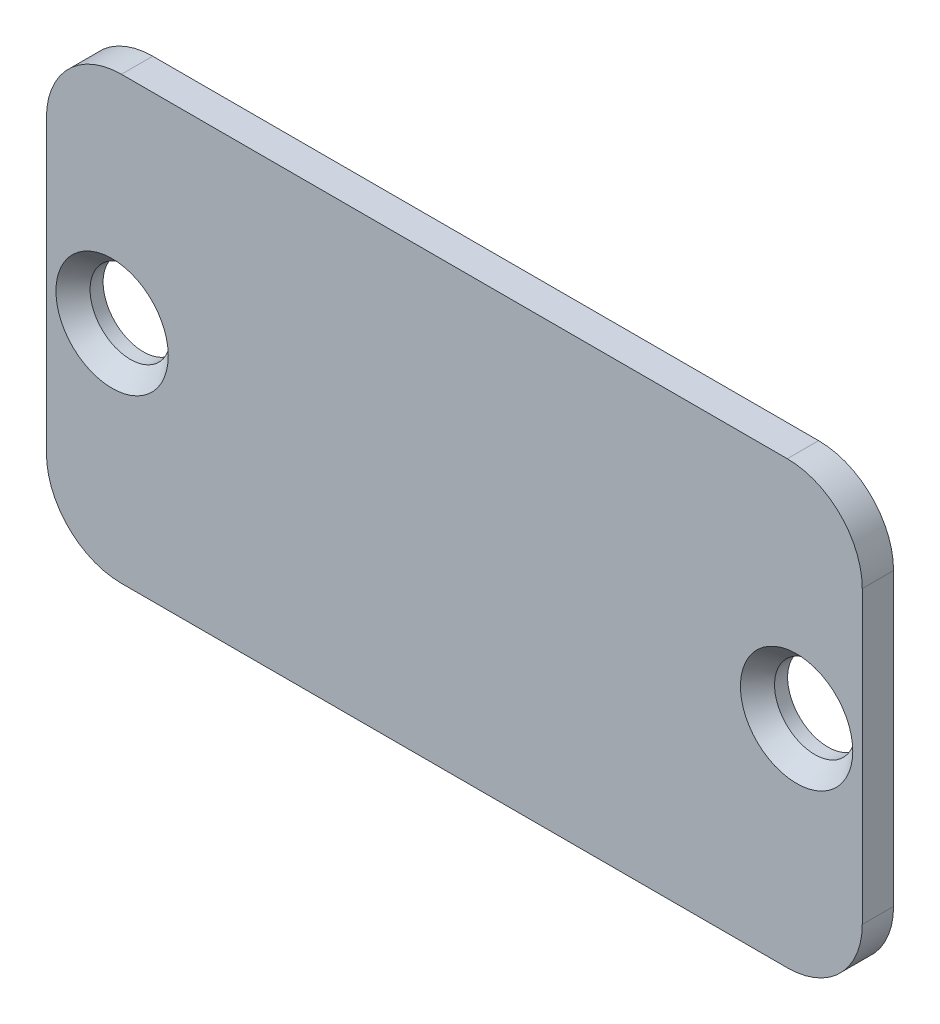
ISO-10303-21;
HEADER;
FILE_DESCRIPTION(('STEP AP214'),'2;1');
FILE_NAME('part.step','',(''),(''),'','','');
FILE_SCHEMA(('AUTOMOTIVE_DESIGN { 1 0 10303 214 1 1 1 1 }'));
ENDSEC;
DATA;
#1=APPLICATION_CONTEXT('core data for automotive mechanical design processes');
#2=APPLICATION_PROTOCOL_DEFINITION('international standard','automotive_design',2000,#1);
#3=PRODUCT_CONTEXT('',#1,'mechanical');
#4=PRODUCT('Part','Part','',(#3));
#5=PRODUCT_RELATED_PRODUCT_CATEGORY('part','',(#4));
#6=PRODUCT_DEFINITION_FORMATION('','',#4);
#7=PRODUCT_DEFINITION_CONTEXT('part definition',#1,'design');
#8=PRODUCT_DEFINITION('design','',#6,#7);
#9=PRODUCT_DEFINITION_SHAPE('','',#8);
#10=(LENGTH_UNIT() NAMED_UNIT(*) SI_UNIT(.MILLI.,.METRE.));
#11=(NAMED_UNIT(*) PLANE_ANGLE_UNIT() SI_UNIT($,.RADIAN.));
#12=(NAMED_UNIT(*) SI_UNIT($,.STERADIAN.) SOLID_ANGLE_UNIT());
#13=UNCERTAINTY_MEASURE_WITH_UNIT(LENGTH_MEASURE(1.E-05),#10,'distance_accuracy_value','');
#14=(GEOMETRIC_REPRESENTATION_CONTEXT(3) GLOBAL_UNCERTAINTY_ASSIGNED_CONTEXT((#13)) GLOBAL_UNIT_ASSIGNED_CONTEXT((#10,
#11,#12)) REPRESENTATION_CONTEXT('',''));
#15=CARTESIAN_POINT('',(0.,0.,0.));
#16=DIRECTION('',(0.,0.,1.));
#17=DIRECTION('',(1.,0.,0.));
#18=AXIS2_PLACEMENT_3D('',#15,#16,#17);
#19=CARTESIAN_POINT('',(-16.9188945819453,7.56499999999998,33.027926773219));
#20=DIRECTION('',(0.,0.,-1.));
#21=DIRECTION('',(-1.,0.,0.));
#22=AXIS2_PLACEMENT_3D('',#19,#20,#21);
#23=CYLINDRICAL_SURFACE('',#22,3.90000000000002);
#24=CARTESIAN_POINT('',(-16.9188945819453,7.56499999999998,31.399786773219));
#25=DIRECTION('',(0.,0.,-1.));
#26=DIRECTION('',(-1.,0.,0.));
#27=AXIS2_PLACEMENT_3D('',#24,#25,#26);
#28=CIRCLE('',#27,3.90000000000002);
#29=CARTESIAN_POINT('',(-20.8188945819453,7.565,31.399786773219));
#30=VERTEX_POINT('',#29);
#31=CARTESIAN_POINT('',(-16.9188945819453,11.465,31.399786773219));
#32=VERTEX_POINT('',#31);
#33=EDGE_CURVE('E134',#30,#32,#28,.T.);
#34=ORIENTED_EDGE('',*,*,#33,.F.);
#35=DIRECTION('',(0.,0.,-1.));
#36=VECTOR('',#35,1.);
#37=CARTESIAN_POINT('',(-20.8188945819453,7.565,33.027926773219));
#38=LINE('',#37,#36);
#39=CARTESIAN_POINT('',(-20.8188945819453,7.565,33.027926773219));
#40=VERTEX_POINT('',#39);
#41=EDGE_CURVE('E11',#40,#30,#38,.T.);
#42=ORIENTED_EDGE('',*,*,#41,.F.);
#43=CARTESIAN_POINT('',(-16.9188945819453,7.56499999999998,33.027926773219));
#44=DIRECTION('',(0.,0.,-1.));
#45=DIRECTION('',(-1.,0.,0.));
#46=AXIS2_PLACEMENT_3D('',#43,#44,#45);
#47=CIRCLE('',#46,3.90000000000002);
#48=CARTESIAN_POINT('',(-16.9188945819453,11.465,33.027926773219));
#49=VERTEX_POINT('',#48);
#50=EDGE_CURVE('E155',#40,#49,#47,.T.);
#51=ORIENTED_EDGE('',*,*,#50,.T.);
#52=DIRECTION('',(0.,0.,-1.));
#53=VECTOR('',#52,1.);
#54=CARTESIAN_POINT('',(-16.9188945819453,11.465,33.027926773219));
#55=LINE('',#54,#53);
#56=EDGE_CURVE('E40',#49,#32,#55,.T.);
#57=ORIENTED_EDGE('',*,*,#56,.T.);
#58=EDGE_LOOP('',(#34,#42,#51,#57));
#59=FACE_BOUND('',#58,.T.);
#60=ADVANCED_FACE('F37',(#59),#23,.T.);
#61=CARTESIAN_POINT('',(-20.8188945819453,-7.565,33.027926773219));
#62=DIRECTION('',(-1.,0.,0.));
#63=DIRECTION('',(0.,0.,1.));
#64=AXIS2_PLACEMENT_3D('',#61,#62,#63);
#65=PLANE('',#64);
#66=DIRECTION('',(0.,1.,0.));
#67=VECTOR('',#66,1.);
#68=CARTESIAN_POINT('',(-20.8188945819453,-7.565,31.399786773219));
#69=LINE('',#68,#67);
#70=CARTESIAN_POINT('',(-20.8188945819453,-7.565,31.399786773219));
#71=VERTEX_POINT('',#70);
#72=EDGE_CURVE('E153',#71,#30,#69,.T.);
#73=ORIENTED_EDGE('',*,*,#72,.F.);
#74=DIRECTION('',(0.,0.,-1.));
#75=VECTOR('',#74,1.);
#76=CARTESIAN_POINT('',(-20.8188945819453,-7.565,33.027926773219));
#77=LINE('',#76,#75);
#78=CARTESIAN_POINT('',(-20.8188945819453,-7.565,33.027926773219));
#79=VERTEX_POINT('',#78);
#80=EDGE_CURVE('E46',#79,#71,#77,.T.);
#81=ORIENTED_EDGE('',*,*,#80,.F.);
#82=DIRECTION('',(0.,1.,0.));
#83=VECTOR('',#82,1.);
#84=CARTESIAN_POINT('',(-20.8188945819453,-7.565,33.027926773219));
#85=LINE('',#84,#83);
#86=EDGE_CURVE('E124',#79,#40,#85,.T.);
#87=ORIENTED_EDGE('',*,*,#86,.T.);
#88=ORIENTED_EDGE('',*,*,#41,.T.);
#89=EDGE_LOOP('',(#73,#81,#87,#88));
#90=FACE_BOUND('',#89,.T.);
#91=ADVANCED_FACE('F167',(#90),#65,.T.);
#92=CARTESIAN_POINT('',(-16.9188945819453,-7.56499999999997,33.027926773219));
#93=DIRECTION('',(0.,0.,-1.));
#94=DIRECTION('',(-1.,0.,0.));
#95=AXIS2_PLACEMENT_3D('',#92,#93,#94);
#96=CYLINDRICAL_SURFACE('',#95,3.90000000000002);
#97=CARTESIAN_POINT('',(-16.9188945819453,-7.56499999999997,31.399786773219));
#98=DIRECTION('',(0.,0.,-1.));
#99=DIRECTION('',(-1.,0.,0.));
#100=AXIS2_PLACEMENT_3D('',#97,#98,#99);
#101=CIRCLE('',#100,3.90000000000002);
#102=CARTESIAN_POINT('',(-16.9188945819453,-11.465,31.399786773219));
#103=VERTEX_POINT('',#102);
#104=EDGE_CURVE('E111',#103,#71,#101,.T.);
#105=ORIENTED_EDGE('',*,*,#104,.F.);
#106=DIRECTION('',(0.,0.,-1.));
#107=VECTOR('',#106,1.);
#108=CARTESIAN_POINT('',(-16.9188945819453,-11.465,33.027926773219));
#109=LINE('',#108,#107);
#110=CARTESIAN_POINT('',(-16.9188945819453,-11.465,33.027926773219));
#111=VERTEX_POINT('',#110);
#112=EDGE_CURVE('E106',#111,#103,#109,.T.);
#113=ORIENTED_EDGE('',*,*,#112,.F.);
#114=CARTESIAN_POINT('',(-16.9188945819453,-7.56499999999997,33.027926773219));
#115=DIRECTION('',(0.,0.,-1.));
#116=DIRECTION('',(-1.,0.,0.));
#117=AXIS2_PLACEMENT_3D('',#114,#115,#116);
#118=CIRCLE('',#117,3.90000000000002);
#119=EDGE_CURVE('E109',#111,#79,#118,.T.);
#120=ORIENTED_EDGE('',*,*,#119,.T.);
#121=ORIENTED_EDGE('',*,*,#80,.T.);
#122=EDGE_LOOP('',(#105,#113,#120,#121));
#123=FACE_BOUND('',#122,.T.);
#124=ADVANCED_FACE('F108',(#123),#96,.T.);
#125=CARTESIAN_POINT('',(17.7111054180547,-11.465,33.027926773219));
#126=DIRECTION('',(0.,-1.,0.));
#127=DIRECTION('',(0.,0.,-1.));
#128=AXIS2_PLACEMENT_3D('',#125,#126,#127);
#129=PLANE('',#128);
#130=DIRECTION('',(-1.,0.,0.));
#131=VECTOR('',#130,1.);
#132=CARTESIAN_POINT('',(17.7111054180547,-11.465,31.399786773219));
#133=LINE('',#132,#131);
#134=CARTESIAN_POINT('',(17.7111054180547,-11.465,31.399786773219));
#135=VERTEX_POINT('',#134);
#136=EDGE_CURVE('E150',#135,#103,#133,.T.);
#137=ORIENTED_EDGE('',*,*,#136,.F.);
#138=DIRECTION('',(0.,0.,-1.));
#139=VECTOR('',#138,1.);
#140=CARTESIAN_POINT('',(17.7111054180547,-11.465,33.027926773219));
#141=LINE('',#140,#139);
#142=CARTESIAN_POINT('',(17.7111054180547,-11.465,33.027926773219));
#143=VERTEX_POINT('',#142);
#144=EDGE_CURVE('E116',#143,#135,#141,.T.);
#145=ORIENTED_EDGE('',*,*,#144,.F.);
#146=DIRECTION('',(-1.,0.,0.));
#147=VECTOR('',#146,1.);
#148=CARTESIAN_POINT('',(17.7111054180547,-11.465,33.027926773219));
#149=LINE('',#148,#147);
#150=EDGE_CURVE('E122',#143,#111,#149,.T.);
#151=ORIENTED_EDGE('',*,*,#150,.T.);
#152=ORIENTED_EDGE('',*,*,#112,.T.);
#153=EDGE_LOOP('',(#137,#145,#151,#152));
#154=FACE_BOUND('',#153,.T.);
#155=ADVANCED_FACE('F126',(#154),#129,.T.);
#156=CARTESIAN_POINT('',(17.7111054180547,-7.565,33.027926773219));
#157=DIRECTION('',(0.,0.,-1.));
#158=DIRECTION('',(-1.,0.,0.));
#159=AXIS2_PLACEMENT_3D('',#156,#157,#158);
#160=CYLINDRICAL_SURFACE('',#159,3.9);
#161=CARTESIAN_POINT('',(17.7111054180547,-7.565,31.399786773219));
#162=DIRECTION('',(0.,0.,-1.));
#163=DIRECTION('',(-1.,0.,0.));
#164=AXIS2_PLACEMENT_3D('',#161,#162,#163);
#165=CIRCLE('',#164,3.9);
#166=CARTESIAN_POINT('',(21.6111054180547,-7.565,31.399786773219));
#167=VERTEX_POINT('',#166);
#168=EDGE_CURVE('E147',#167,#135,#165,.T.);
#169=ORIENTED_EDGE('',*,*,#168,.F.);
#170=DIRECTION('',(0.,0.,-1.));
#171=VECTOR('',#170,1.);
#172=CARTESIAN_POINT('',(21.6111054180547,-7.565,33.027926773219));
#173=LINE('',#172,#171);
#174=CARTESIAN_POINT('',(21.6111054180547,-7.565,33.027926773219));
#175=VERTEX_POINT('',#174);
#176=EDGE_CURVE('E159',#175,#167,#173,.T.);
#177=ORIENTED_EDGE('',*,*,#176,.F.);
#178=CARTESIAN_POINT('',(17.7111054180547,-7.565,33.027926773219));
#179=DIRECTION('',(0.,0.,-1.));
#180=DIRECTION('',(-1.,0.,0.));
#181=AXIS2_PLACEMENT_3D('',#178,#179,#180);
#182=CIRCLE('',#181,3.9);
#183=EDGE_CURVE('E127',#175,#143,#182,.T.);
#184=ORIENTED_EDGE('',*,*,#183,.T.);
#185=ORIENTED_EDGE('',*,*,#144,.T.);
#186=EDGE_LOOP('',(#169,#177,#184,#185));
#187=FACE_BOUND('',#186,.T.);
#188=ADVANCED_FACE('F180',(#187),#160,.T.);
#189=CARTESIAN_POINT('',(21.6111054180547,7.565,33.027926773219));
#190=DIRECTION('',(1.,0.,0.));
#191=DIRECTION('',(0.,0.,-1.));
#192=AXIS2_PLACEMENT_3D('',#189,#190,#191);
#193=PLANE('',#192);
#194=DIRECTION('',(0.,-1.,0.));
#195=VECTOR('',#194,1.);
#196=CARTESIAN_POINT('',(21.6111054180547,7.565,31.399786773219));
#197=LINE('',#196,#195);
#198=CARTESIAN_POINT('',(21.6111054180547,7.565,31.399786773219));
#199=VERTEX_POINT('',#198);
#200=EDGE_CURVE('E144',#199,#167,#197,.T.);
#201=ORIENTED_EDGE('',*,*,#200,.F.);
#202=DIRECTION('',(0.,0.,-1.));
#203=VECTOR('',#202,1.);
#204=CARTESIAN_POINT('',(21.6111054180547,7.565,33.027926773219));
#205=LINE('',#204,#203);
#206=CARTESIAN_POINT('',(21.6111054180547,7.565,33.027926773219));
#207=VERTEX_POINT('',#206);
#208=EDGE_CURVE('E161',#207,#199,#205,.T.);
#209=ORIENTED_EDGE('',*,*,#208,.F.);
#210=DIRECTION('',(0.,-1.,0.));
#211=VECTOR('',#210,1.);
#212=CARTESIAN_POINT('',(21.6111054180547,7.565,33.027926773219));
#213=LINE('',#212,#211);
#214=EDGE_CURVE('E129',#207,#175,#213,.T.);
#215=ORIENTED_EDGE('',*,*,#214,.T.);
#216=ORIENTED_EDGE('',*,*,#176,.T.);
#217=EDGE_LOOP('',(#201,#209,#215,#216));
#218=FACE_BOUND('',#217,.T.);
#219=ADVANCED_FACE('F183',(#218),#193,.T.);
#220=CARTESIAN_POINT('',(17.7111054180547,7.56499999999998,33.027926773219));
#221=DIRECTION('',(0.,0.,-1.));
#222=DIRECTION('',(-1.,0.,0.));
#223=AXIS2_PLACEMENT_3D('',#220,#221,#222);
#224=CYLINDRICAL_SURFACE('',#223,3.90000000000002);
#225=CARTESIAN_POINT('',(17.7111054180547,7.56499999999998,31.399786773219));
#226=DIRECTION('',(0.,0.,-1.));
#227=DIRECTION('',(-1.,0.,0.));
#228=AXIS2_PLACEMENT_3D('',#225,#226,#227);
#229=CIRCLE('',#228,3.90000000000002);
#230=CARTESIAN_POINT('',(17.7111054180547,11.465,31.399786773219));
#231=VERTEX_POINT('',#230);
#232=EDGE_CURVE('E141',#231,#199,#229,.T.);
#233=ORIENTED_EDGE('',*,*,#232,.F.);
#234=DIRECTION('',(0.,0.,-1.));
#235=VECTOR('',#234,1.);
#236=CARTESIAN_POINT('',(17.7111054180547,11.465,33.027926773219));
#237=LINE('',#236,#235);
#238=CARTESIAN_POINT('',(17.7111054180547,11.465,33.027926773219));
#239=VERTEX_POINT('',#238);
#240=EDGE_CURVE('E162',#239,#231,#237,.T.);
#241=ORIENTED_EDGE('',*,*,#240,.F.);
#242=CARTESIAN_POINT('',(17.7111054180547,7.56499999999998,33.027926773219));
#243=DIRECTION('',(0.,0.,-1.));
#244=DIRECTION('',(-1.,0.,0.));
#245=AXIS2_PLACEMENT_3D('',#242,#243,#244);
#246=CIRCLE('',#245,3.90000000000002);
#247=EDGE_CURVE('E243',#239,#207,#246,.T.);
#248=ORIENTED_EDGE('',*,*,#247,.T.);
#249=ORIENTED_EDGE('',*,*,#208,.T.);
#250=EDGE_LOOP('',(#233,#241,#248,#249));
#251=FACE_BOUND('',#250,.T.);
#252=ADVANCED_FACE('F187',(#251),#224,.T.);
#253=CARTESIAN_POINT('',(-16.9188945819453,11.465,33.027926773219));
#254=DIRECTION('',(0.,1.,0.));
#255=DIRECTION('',(0.,0.,1.));
#256=AXIS2_PLACEMENT_3D('',#253,#254,#255);
#257=PLANE('',#256);
#258=DIRECTION('',(1.,0.,0.));
#259=VECTOR('',#258,1.);
#260=CARTESIAN_POINT('',(-16.9188945819453,11.465,31.399786773219));
#261=LINE('',#260,#259);
#262=EDGE_CURVE('E137',#32,#231,#261,.T.);
#263=ORIENTED_EDGE('',*,*,#262,.F.);
#264=ORIENTED_EDGE('',*,*,#56,.F.);
#265=DIRECTION('',(1.,0.,0.));
#266=VECTOR('',#265,1.);
#267=CARTESIAN_POINT('',(-16.9188945819453,11.465,33.027926773219));
#268=LINE('',#267,#266);
#269=EDGE_CURVE('E241',#49,#239,#268,.T.);
#270=ORIENTED_EDGE('',*,*,#269,.T.);
#271=ORIENTED_EDGE('',*,*,#240,.T.);
#272=EDGE_LOOP('',(#263,#264,#270,#271));
#273=FACE_BOUND('',#272,.T.);
#274=ADVANCED_FACE('F164',(#273),#257,.T.);
#275=CARTESIAN_POINT('',(-16.9188945819453,7.56499999999998,33.027926773219));
#276=DIRECTION('',(0.,0.,-1.));
#277=DIRECTION('',(-1.,0.,0.));
#278=AXIS2_PLACEMENT_3D('',#275,#276,#277);
#279=PLANE('',#278);
#280=CARTESIAN_POINT('',(-17.4038945819453,0.,33.027926773219));
#281=DIRECTION('',(0.,0.,1.));
#282=DIRECTION('',(1.,0.,0.));
#283=AXIS2_PLACEMENT_3D('',#280,#281,#282);
#284=CIRCLE('',#283,2.92099999999999);
#285=CARTESIAN_POINT('',(-14.4828945819453,0.,33.027926773219));
#286=VERTEX_POINT('',#285);
#287=EDGE_CURVE('E225',#286,#286,#284,.T.);
#288=ORIENTED_EDGE('',*,*,#287,.F.);
#289=EDGE_LOOP('',(#288));
#290=FACE_BOUND('',#289,.T.);
#291=CARTESIAN_POINT('',(18.1961054180547,0.,33.027926773219));
#292=DIRECTION('',(0.,0.,1.));
#293=DIRECTION('',(1.,0.,0.));
#294=AXIS2_PLACEMENT_3D('',#291,#292,#293);
#295=CIRCLE('',#294,2.92099999999999);
#296=CARTESIAN_POINT('',(21.1171054180547,0.,33.027926773219));
#297=VERTEX_POINT('',#296);
#298=EDGE_CURVE('E232',#297,#297,#295,.T.);
#299=ORIENTED_EDGE('',*,*,#298,.F.);
#300=EDGE_LOOP('',(#299));
#301=FACE_BOUND('',#300,.T.);
#302=ORIENTED_EDGE('',*,*,#50,.F.);
#303=ORIENTED_EDGE('',*,*,#86,.F.);
#304=ORIENTED_EDGE('',*,*,#119,.F.);
#305=ORIENTED_EDGE('',*,*,#150,.F.);
#306=ORIENTED_EDGE('',*,*,#183,.F.);
#307=ORIENTED_EDGE('',*,*,#214,.F.);
#308=ORIENTED_EDGE('',*,*,#247,.F.);
#309=ORIENTED_EDGE('',*,*,#269,.F.);
#310=EDGE_LOOP('',(#302,#303,#304,#305,#306,#307,#308,#309));
#311=FACE_BOUND('',#310,.T.);
#312=ADVANCED_FACE('F120',(#290,#301,#311),#279,.F.);
#313=CARTESIAN_POINT('',(-16.9188945819453,7.56499999999998,31.399786773219));
#314=DIRECTION('',(0.,0.,-1.));
#315=DIRECTION('',(-1.,0.,0.));
#316=AXIS2_PLACEMENT_3D('',#313,#314,#315);
#317=PLANE('',#316);
#318=CARTESIAN_POINT('',(-17.4038945819453,0.,31.399786773219));
#319=DIRECTION('',(0.,0.,1.));
#320=DIRECTION('',(1.,0.,0.));
#321=AXIS2_PLACEMENT_3D('',#318,#319,#320);
#322=CIRCLE('',#321,2.09549999999997);
#323=CARTESIAN_POINT('',(-15.3083945819453,0.,31.399786773219));
#324=VERTEX_POINT('',#323);
#325=EDGE_CURVE('E227',#324,#324,#322,.T.);
#326=ORIENTED_EDGE('',*,*,#325,.T.);
#327=EDGE_LOOP('',(#326));
#328=FACE_BOUND('',#327,.T.);
#329=CARTESIAN_POINT('',(18.1961054180547,0.,31.399786773219));
#330=DIRECTION('',(0.,0.,1.));
#331=DIRECTION('',(1.,0.,0.));
#332=AXIS2_PLACEMENT_3D('',#329,#330,#331);
#333=CIRCLE('',#332,2.09549999999997);
#334=CARTESIAN_POINT('',(20.2916054180547,0.,31.399786773219));
#335=VERTEX_POINT('',#334);
#336=EDGE_CURVE('E138',#335,#335,#333,.T.);
#337=ORIENTED_EDGE('',*,*,#336,.T.);
#338=EDGE_LOOP('',(#337));
#339=FACE_BOUND('',#338,.T.);
#340=ORIENTED_EDGE('',*,*,#33,.T.);
#341=ORIENTED_EDGE('',*,*,#262,.T.);
#342=ORIENTED_EDGE('',*,*,#232,.T.);
#343=ORIENTED_EDGE('',*,*,#200,.T.);
#344=ORIENTED_EDGE('',*,*,#168,.T.);
#345=ORIENTED_EDGE('',*,*,#136,.T.);
#346=ORIENTED_EDGE('',*,*,#104,.T.);
#347=ORIENTED_EDGE('',*,*,#72,.T.);
#348=EDGE_LOOP('',(#340,#341,#342,#343,#344,#345,#346,#347));
#349=FACE_BOUND('',#348,.T.);
#350=ADVANCED_FACE('F166',(#328,#339,#349),#317,.T.);
#351=CARTESIAN_POINT('',(18.1961054180547,0.,33.027926773219));
#352=DIRECTION('',(0.,0.,1.));
#353=DIRECTION('',(1.,0.,0.));
#354=AXIS2_PLACEMENT_3D('',#351,#352,#353);
#355=CYLINDRICAL_SURFACE('',#354,2.09549999999997);
#356=ORIENTED_EDGE('',*,*,#336,.F.);
#357=EDGE_LOOP('',(#356));
#358=FACE_BOUND('',#357,.T.);
#359=CARTESIAN_POINT('',(18.1961054180547,0.,32.078297653058));
#360=DIRECTION('',(0.,0.,1.));
#361=DIRECTION('',(1.,0.,0.));
#362=AXIS2_PLACEMENT_3D('',#359,#360,#361);
#363=CIRCLE('',#362,2.09549999999997);
#364=CARTESIAN_POINT('',(20.2916054180547,0.,32.078297653058));
#365=VERTEX_POINT('',#364);
#366=EDGE_CURVE('E235',#365,#365,#363,.T.);
#367=ORIENTED_EDGE('',*,*,#366,.T.);
#368=EDGE_LOOP('',(#367));
#369=FACE_BOUND('',#368,.T.);
#370=ADVANCED_FACE('F199',(#358,#369),#355,.F.);
#371=CARTESIAN_POINT('',(18.1961054180547,0.,33.027926773219));
#372=DIRECTION('',(0.,0.,1.));
#373=DIRECTION('',(1.,0.,0.));
#374=AXIS2_PLACEMENT_3D('',#371,#372,#373);
#375=CONICAL_SURFACE('',#374,2.92099999999999,0.715584993317676);
#376=ORIENTED_EDGE('',*,*,#366,.F.);
#377=EDGE_LOOP('',(#376));
#378=FACE_BOUND('',#377,.T.);
#379=ORIENTED_EDGE('',*,*,#298,.T.);
#380=EDGE_LOOP('',(#379));
#381=FACE_BOUND('',#380,.T.);
#382=ADVANCED_FACE('F206',(#378,#381),#375,.F.);
#383=CARTESIAN_POINT('',(-17.4038945819453,0.,33.027926773219));
#384=DIRECTION('',(0.,0.,1.));
#385=DIRECTION('',(1.,0.,0.));
#386=AXIS2_PLACEMENT_3D('',#383,#384,#385);
#387=CYLINDRICAL_SURFACE('',#386,2.09549999999997);
#388=ORIENTED_EDGE('',*,*,#325,.F.);
#389=EDGE_LOOP('',(#388));
#390=FACE_BOUND('',#389,.T.);
#391=CARTESIAN_POINT('',(-17.4038945819453,0.,32.078297653058));
#392=DIRECTION('',(0.,0.,1.));
#393=DIRECTION('',(1.,0.,0.));
#394=AXIS2_PLACEMENT_3D('',#391,#392,#393);
#395=CIRCLE('',#394,2.09549999999997);
#396=CARTESIAN_POINT('',(-15.3083945819453,0.,32.078297653058));
#397=VERTEX_POINT('',#396);
#398=EDGE_CURVE('E223',#397,#397,#395,.T.);
#399=ORIENTED_EDGE('',*,*,#398,.T.);
#400=EDGE_LOOP('',(#399));
#401=FACE_BOUND('',#400,.T.);
#402=ADVANCED_FACE('F210',(#390,#401),#387,.F.);
#403=CARTESIAN_POINT('',(-17.4038945819453,0.,33.027926773219));
#404=DIRECTION('',(0.,0.,1.));
#405=DIRECTION('',(1.,0.,0.));
#406=AXIS2_PLACEMENT_3D('',#403,#404,#405);
#407=CONICAL_SURFACE('',#406,2.92099999999999,0.715584993317675);
#408=ORIENTED_EDGE('',*,*,#398,.F.);
#409=EDGE_LOOP('',(#408));
#410=FACE_BOUND('',#409,.T.);
#411=ORIENTED_EDGE('',*,*,#287,.T.);
#412=EDGE_LOOP('',(#411));
#413=FACE_BOUND('',#412,.T.);
#414=ADVANCED_FACE('F214',(#410,#413),#407,.F.);
#415=CLOSED_SHELL('',(#60,#91,#124,#155,#188,#219,#252,#274,#312,#350,#370,#382,#402,#414));
#416=MANIFOLD_SOLID_BREP('B2',#415);
#417=ADVANCED_BREP_SHAPE_REPRESENTATION('',(#18,#416),#14);
#418=SHAPE_DEFINITION_REPRESENTATION(#9,#417);
ENDSEC;
END-ISO-10303-21;
